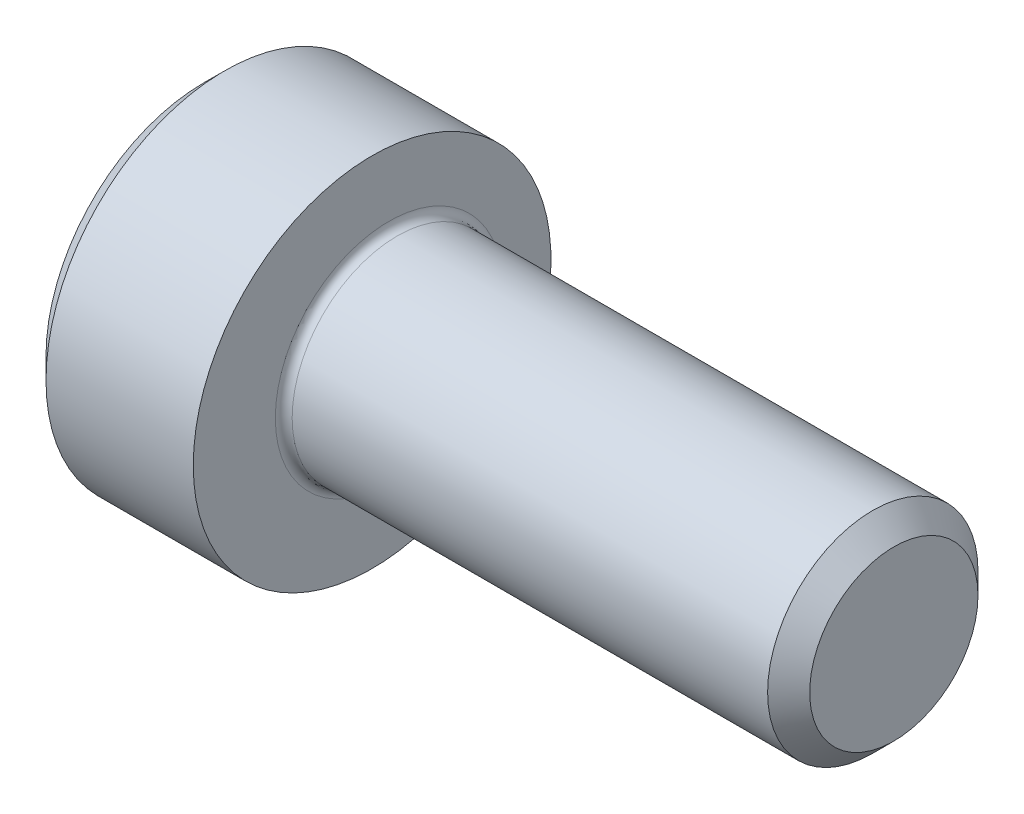
ISO-10303-21;
HEADER;
FILE_DESCRIPTION(('STEP AP214'),'2;1');
FILE_NAME('part.step','',(''),(''),'','','');
FILE_SCHEMA(('AUTOMOTIVE_DESIGN { 1 0 10303 214 1 1 1 1 }'));
ENDSEC;
DATA;
#1=APPLICATION_CONTEXT('core data for automotive mechanical design processes');
#2=APPLICATION_PROTOCOL_DEFINITION('international standard','automotive_design',2000,#1);
#3=PRODUCT_CONTEXT('',#1,'mechanical');
#4=PRODUCT('Part','Part','',(#3));
#5=PRODUCT_RELATED_PRODUCT_CATEGORY('part','',(#4));
#6=PRODUCT_DEFINITION_FORMATION('','',#4);
#7=PRODUCT_DEFINITION_CONTEXT('part definition',#1,'design');
#8=PRODUCT_DEFINITION('design','',#6,#7);
#9=PRODUCT_DEFINITION_SHAPE('','',#8);
#10=(LENGTH_UNIT() NAMED_UNIT(*) SI_UNIT(.MILLI.,.METRE.));
#11=(NAMED_UNIT(*) PLANE_ANGLE_UNIT() SI_UNIT($,.RADIAN.));
#12=(NAMED_UNIT(*) SI_UNIT($,.STERADIAN.) SOLID_ANGLE_UNIT());
#13=UNCERTAINTY_MEASURE_WITH_UNIT(LENGTH_MEASURE(1.E-05),#10,'distance_accuracy_value','');
#14=(GEOMETRIC_REPRESENTATION_CONTEXT(3) GLOBAL_UNCERTAINTY_ASSIGNED_CONTEXT((#13)) GLOBAL_UNIT_ASSIGNED_CONTEXT((#10,
#11,#12)) REPRESENTATION_CONTEXT('',''));
#15=CARTESIAN_POINT('',(0.,0.,0.));
#16=DIRECTION('',(0.,0.,1.));
#17=DIRECTION('',(1.,0.,0.));
#18=AXIS2_PLACEMENT_3D('',#15,#16,#17);
#19=CARTESIAN_POINT('',(2.5,0.,0.));
#20=DIRECTION('',(-1.,0.,0.));
#21=DIRECTION('',(0.,0.,1.));
#22=AXIS2_PLACEMENT_3D('',#19,#20,#21);
#23=PLANE('',#22);
#24=DIRECTION('',(0.,-1.,0.));
#25=VECTOR('',#24,1.);
#26=CARTESIAN_POINT('',(2.5,1.17894924968521,-2.042));
#27=LINE('',#26,#25);
#28=CARTESIAN_POINT('',(2.5,1.17894924968521,-2.042));
#29=VERTEX_POINT('',#28);
#30=CARTESIAN_POINT('',(2.5,0.,-2.042));
#31=VERTEX_POINT('',#30);
#32=EDGE_CURVE('E223',#29,#31,#27,.T.);
#33=ORIENTED_EDGE('',*,*,#32,.T.);
#34=CARTESIAN_POINT('',(2.5,0.,0.));
#35=DIRECTION('',(1.,0.,0.));
#36=DIRECTION('',(0.,0.,-1.));
#37=AXIS2_PLACEMENT_3D('',#34,#35,#36);
#38=CIRCLE('',#37,2.042);
#39=CARTESIAN_POINT('',(2.5,1.76842387452782,-1.02100000000001));
#40=VERTEX_POINT('',#39);
#41=EDGE_CURVE('E54',#31,#40,#38,.T.);
#42=ORIENTED_EDGE('',*,*,#41,.T.);
#43=DIRECTION('',(0.,-0.500000000000002,-0.866025403784437));
#44=VECTOR('',#43,1.);
#45=CARTESIAN_POINT('',(2.5,2.35789849937043,0.));
#46=LINE('',#45,#44);
#47=EDGE_CURVE('E254',#40,#29,#46,.T.);
#48=ORIENTED_EDGE('',*,*,#47,.T.);
#49=EDGE_LOOP('',(#33,#42,#48));
#50=FACE_BOUND('',#49,.T.);
#51=ADVANCED_FACE('F39',(#50),#23,.T.);
#52=CARTESIAN_POINT('',(2.5,2.35789849937043,0.));
#53=VERTEX_POINT('',#52);
#54=EDGE_CURVE('E251',#53,#40,#46,.T.);
#55=ORIENTED_EDGE('',*,*,#54,.T.);
#56=CARTESIAN_POINT('',(2.5,1.76842387452783,1.021));
#57=VERTEX_POINT('',#56);
#58=EDGE_CURVE('E210',#40,#57,#38,.T.);
#59=ORIENTED_EDGE('',*,*,#58,.T.);
#60=DIRECTION('',(0.,0.499999999999999,-0.866025403784439));
#61=VECTOR('',#60,1.);
#62=CARTESIAN_POINT('',(2.5,1.17894924968521,2.042));
#63=LINE('',#62,#61);
#64=EDGE_CURVE('E258',#57,#53,#63,.T.);
#65=ORIENTED_EDGE('',*,*,#64,.T.);
#66=EDGE_LOOP('',(#55,#59,#65));
#67=FACE_BOUND('',#66,.T.);
#68=ADVANCED_FACE('F131',(#67),#23,.T.);
#69=CARTESIAN_POINT('',(2.5,1.17894924968521,2.042));
#70=VERTEX_POINT('',#69);
#71=EDGE_CURVE('E255',#70,#57,#63,.T.);
#72=ORIENTED_EDGE('',*,*,#71,.T.);
#73=CARTESIAN_POINT('',(2.5,0.,2.042));
#74=VERTEX_POINT('',#73);
#75=EDGE_CURVE('E212',#57,#74,#38,.T.);
#76=ORIENTED_EDGE('',*,*,#75,.T.);
#77=DIRECTION('',(0.,1.,0.));
#78=VECTOR('',#77,1.);
#79=CARTESIAN_POINT('',(2.5,-1.17894924968522,2.042));
#80=LINE('',#79,#78);
#81=EDGE_CURVE('E262',#74,#70,#80,.T.);
#82=ORIENTED_EDGE('',*,*,#81,.T.);
#83=EDGE_LOOP('',(#72,#76,#82));
#84=FACE_BOUND('',#83,.T.);
#85=ADVANCED_FACE('F136',(#84),#23,.T.);
#86=CARTESIAN_POINT('',(2.5,-1.17894924968522,2.042));
#87=VERTEX_POINT('',#86);
#88=EDGE_CURVE('E259',#87,#74,#80,.T.);
#89=ORIENTED_EDGE('',*,*,#88,.T.);
#90=CARTESIAN_POINT('',(2.5,-1.76842387452783,1.021));
#91=VERTEX_POINT('',#90);
#92=EDGE_CURVE('E310',#74,#91,#38,.T.);
#93=ORIENTED_EDGE('',*,*,#92,.T.);
#94=DIRECTION('',(0.,0.5,0.866025403784438));
#95=VECTOR('',#94,1.);
#96=CARTESIAN_POINT('',(2.5,-2.35789849937043,0.));
#97=LINE('',#96,#95);
#98=EDGE_CURVE('E266',#91,#87,#97,.T.);
#99=ORIENTED_EDGE('',*,*,#98,.T.);
#100=EDGE_LOOP('',(#89,#93,#99));
#101=FACE_BOUND('',#100,.T.);
#102=ADVANCED_FACE('F309',(#101),#23,.T.);
#103=CARTESIAN_POINT('',(2.5,-2.35789849937043,0.));
#104=VERTEX_POINT('',#103);
#105=EDGE_CURVE('E263',#104,#91,#97,.T.);
#106=ORIENTED_EDGE('',*,*,#105,.T.);
#107=CARTESIAN_POINT('',(2.5,-1.76842387452783,-1.021));
#108=VERTEX_POINT('',#107);
#109=EDGE_CURVE('E311',#91,#108,#38,.T.);
#110=ORIENTED_EDGE('',*,*,#109,.T.);
#111=DIRECTION('',(0.,-0.5,0.866025403784439));
#112=VECTOR('',#111,1.);
#113=CARTESIAN_POINT('',(2.5,-1.17894924968522,-2.042));
#114=LINE('',#113,#112);
#115=EDGE_CURVE('E235',#108,#104,#114,.T.);
#116=ORIENTED_EDGE('',*,*,#115,.T.);
#117=EDGE_LOOP('',(#106,#110,#116));
#118=FACE_BOUND('',#117,.T.);
#119=ADVANCED_FACE('F128',(#118),#23,.T.);
#120=CARTESIAN_POINT('',(4.,0.,0.));
#121=DIRECTION('',(-1.,0.,0.));
#122=DIRECTION('',(0.,0.,1.));
#123=AXIS2_PLACEMENT_3D('',#120,#121,#122);
#124=CYLINDRICAL_SURFACE('',#123,4.25);
#125=CARTESIAN_POINT('',(0.500000000000008,0.,0.));
#126=DIRECTION('',(-1.,0.,0.));
#127=DIRECTION('',(0.,0.,1.));
#128=AXIS2_PLACEMENT_3D('',#125,#126,#127);
#129=CIRCLE('',#128,4.25);
#130=CARTESIAN_POINT('',(0.500000000000008,0.,4.25));
#131=VERTEX_POINT('',#130);
#132=EDGE_CURVE('E190',#131,#131,#129,.F.);
#133=ORIENTED_EDGE('',*,*,#132,.T.);
#134=EDGE_LOOP('',(#133));
#135=FACE_BOUND('',#134,.T.);
#136=CARTESIAN_POINT('',(4.,0.,0.));
#137=DIRECTION('',(-1.,0.,0.));
#138=DIRECTION('',(0.,0.,1.));
#139=AXIS2_PLACEMENT_3D('',#136,#137,#138);
#140=CIRCLE('',#139,4.25);
#141=CARTESIAN_POINT('',(4.,0.,4.25));
#142=VERTEX_POINT('',#141);
#143=EDGE_CURVE('E215',#142,#142,#140,.T.);
#144=ORIENTED_EDGE('',*,*,#143,.T.);
#145=EDGE_LOOP('',(#144));
#146=FACE_BOUND('',#145,.T.);
#147=ADVANCED_FACE('F177',(#135,#146),#124,.T.);
#148=CARTESIAN_POINT('',(4.,4.25,0.));
#149=DIRECTION('',(1.,0.,0.));
#150=DIRECTION('',(0.,0.,-1.));
#151=AXIS2_PLACEMENT_3D('',#148,#149,#150);
#152=PLANE('',#151);
#153=CARTESIAN_POINT('',(4.,0.,-0.4));
#154=DIRECTION('',(1.,0.,0.));
#155=DIRECTION('',(0.,0.,-1.));
#156=AXIS2_PLACEMENT_3D('',#153,#154,#155);
#157=CIRCLE('',#156,2.7);
#158=CARTESIAN_POINT('',(4.,0.,-3.1));
#159=VERTEX_POINT('',#158);
#160=EDGE_CURVE('E11',#159,#159,#157,.F.);
#161=ORIENTED_EDGE('',*,*,#160,.T.);
#162=EDGE_LOOP('',(#161));
#163=FACE_BOUND('',#162,.T.);
#164=ORIENTED_EDGE('',*,*,#143,.F.);
#165=EDGE_LOOP('',(#164));
#166=FACE_BOUND('',#165,.T.);
#167=ADVANCED_FACE('F173',(#163,#166),#152,.T.);
#168=CARTESIAN_POINT('',(0.,0.,0.));
#169=DIRECTION('',(-1.,0.,0.));
#170=DIRECTION('',(0.,0.,1.));
#171=AXIS2_PLACEMENT_3D('',#168,#169,#170);
#172=PLANE('',#171);
#173=CARTESIAN_POINT('',(0.,0.,2.8));
#174=DIRECTION('',(-1.,0.,0.));
#175=DIRECTION('',(0.,0.,1.));
#176=AXIS2_PLACEMENT_3D('',#173,#174,#175);
#177=CIRCLE('',#176,0.25);
#178=CARTESIAN_POINT('',(0.,0.,3.05));
#179=VERTEX_POINT('',#178);
#180=EDGE_CURVE('E271',#179,#179,#177,.T.);
#181=ORIENTED_EDGE('',*,*,#180,.F.);
#182=EDGE_LOOP('',(#181));
#183=FACE_BOUND('',#182,.T.);
#184=CARTESIAN_POINT('',(0.,0.,0.));
#185=DIRECTION('',(-1.,0.,0.));
#186=DIRECTION('',(0.,0.,1.));
#187=AXIS2_PLACEMENT_3D('',#184,#185,#186);
#188=CIRCLE('',#187,3.75);
#189=CARTESIAN_POINT('',(0.,0.,3.75));
#190=VERTEX_POINT('',#189);
#191=EDGE_CURVE('E193',#190,#190,#188,.T.);
#192=ORIENTED_EDGE('',*,*,#191,.T.);
#193=EDGE_LOOP('',(#192));
#194=FACE_BOUND('',#193,.T.);
#195=DIRECTION('',(0.,-0.5,0.866025403784439));
#196=VECTOR('',#195,1.);
#197=CARTESIAN_POINT('',(0.,-1.17894924968522,-2.042));
#198=LINE('',#197,#196);
#199=CARTESIAN_POINT('',(0.,-1.17894924968522,-2.042));
#200=VERTEX_POINT('',#199);
#201=CARTESIAN_POINT('',(0.,-2.35789849937043,0.));
#202=VERTEX_POINT('',#201);
#203=EDGE_CURVE('E62',#200,#202,#198,.T.);
#204=ORIENTED_EDGE('',*,*,#203,.F.);
#205=DIRECTION('',(0.,-1.,0.));
#206=VECTOR('',#205,1.);
#207=CARTESIAN_POINT('',(0.,1.17894924968521,-2.042));
#208=LINE('',#207,#206);
#209=CARTESIAN_POINT('',(0.,1.17894924968521,-2.042));
#210=VERTEX_POINT('',#209);
#211=EDGE_CURVE('E232',#210,#200,#208,.T.);
#212=ORIENTED_EDGE('',*,*,#211,.F.);
#213=DIRECTION('',(0.,-0.500000000000002,-0.866025403784437));
#214=VECTOR('',#213,1.);
#215=CARTESIAN_POINT('',(0.,2.35789849937043,0.));
#216=LINE('',#215,#214);
#217=CARTESIAN_POINT('',(0.,2.35789849937043,0.));
#218=VERTEX_POINT('',#217);
#219=EDGE_CURVE('E236',#218,#210,#216,.T.);
#220=ORIENTED_EDGE('',*,*,#219,.F.);
#221=DIRECTION('',(0.,0.499999999999999,-0.866025403784439));
#222=VECTOR('',#221,1.);
#223=CARTESIAN_POINT('',(0.,1.17894924968521,2.042));
#224=LINE('',#223,#222);
#225=CARTESIAN_POINT('',(0.,1.17894924968521,2.042));
#226=VERTEX_POINT('',#225);
#227=EDGE_CURVE('E239',#226,#218,#224,.T.);
#228=ORIENTED_EDGE('',*,*,#227,.F.);
#229=DIRECTION('',(0.,1.,0.));
#230=VECTOR('',#229,1.);
#231=CARTESIAN_POINT('',(0.,-1.17894924968522,2.042));
#232=LINE('',#231,#230);
#233=CARTESIAN_POINT('',(0.,-1.17894924968522,2.042));
#234=VERTEX_POINT('',#233);
#235=EDGE_CURVE('E242',#234,#226,#232,.T.);
#236=ORIENTED_EDGE('',*,*,#235,.F.);
#237=DIRECTION('',(0.,0.5,0.866025403784438));
#238=VECTOR('',#237,1.);
#239=CARTESIAN_POINT('',(0.,-2.35789849937043,0.));
#240=LINE('',#239,#238);
#241=EDGE_CURVE('E245',#202,#234,#240,.T.);
#242=ORIENTED_EDGE('',*,*,#241,.F.);
#243=EDGE_LOOP('',(#204,#212,#220,#228,#236,#242));
#244=FACE_BOUND('',#243,.T.);
#245=ADVANCED_FACE('F169',(#183,#194,#244),#172,.T.);
#246=CARTESIAN_POINT('',(16.,0.,-0.4));
#247=DIRECTION('',(-1.,0.,0.));
#248=DIRECTION('',(0.,0.,1.));
#249=AXIS2_PLACEMENT_3D('',#246,#247,#248);
#250=CYLINDRICAL_SURFACE('',#249,2.5);
#251=CARTESIAN_POINT('',(4.2,0.,-0.4));
#252=DIRECTION('',(1.,0.,0.));
#253=DIRECTION('',(0.,0.,-1.));
#254=AXIS2_PLACEMENT_3D('',#251,#252,#253);
#255=CIRCLE('',#254,2.5);
#256=CARTESIAN_POINT('',(4.2,0.,-2.9));
#257=VERTEX_POINT('',#256);
#258=EDGE_CURVE('E47',#257,#257,#255,.T.);
#259=ORIENTED_EDGE('',*,*,#258,.T.);
#260=EDGE_LOOP('',(#259));
#261=FACE_BOUND('',#260,.T.);
#262=CARTESIAN_POINT('',(15.5,0.,-0.4));
#263=DIRECTION('',(1.,0.,0.));
#264=DIRECTION('',(0.,0.,-1.));
#265=AXIS2_PLACEMENT_3D('',#262,#263,#264);
#266=CIRCLE('',#265,2.5);
#267=CARTESIAN_POINT('',(15.5,0.,-2.9));
#268=VERTEX_POINT('',#267);
#269=EDGE_CURVE('E195',#268,#268,#266,.F.);
#270=ORIENTED_EDGE('',*,*,#269,.T.);
#271=EDGE_LOOP('',(#270));
#272=FACE_BOUND('',#271,.T.);
#273=ADVANCED_FACE('F165',(#261,#272),#250,.T.);
#274=CARTESIAN_POINT('',(16.,0.,-0.4));
#275=DIRECTION('',(1.,0.,0.));
#276=DIRECTION('',(0.,0.,-1.));
#277=AXIS2_PLACEMENT_3D('',#274,#275,#276);
#278=PLANE('',#277);
#279=CARTESIAN_POINT('',(16.,0.,-0.4));
#280=DIRECTION('',(1.,0.,0.));
#281=DIRECTION('',(0.,0.,-1.));
#282=AXIS2_PLACEMENT_3D('',#279,#280,#281);
#283=CIRCLE('',#282,2.);
#284=CARTESIAN_POINT('',(16.,0.,-2.4));
#285=VERTEX_POINT('',#284);
#286=EDGE_CURVE('E199',#285,#285,#283,.T.);
#287=ORIENTED_EDGE('',*,*,#286,.T.);
#288=EDGE_LOOP('',(#287));
#289=FACE_BOUND('',#288,.T.);
#290=ADVANCED_FACE('F162',(#289),#278,.T.);
#291=CARTESIAN_POINT('',(2.5,-1.17894924968522,-2.042));
#292=DIRECTION('',(0.,-0.866025403784439,-0.5));
#293=DIRECTION('',(0.,0.5,-0.866025403784439));
#294=AXIS2_PLACEMENT_3D('',#291,#292,#293);
#295=PLANE('',#294);
#296=ORIENTED_EDGE('',*,*,#203,.T.);
#297=DIRECTION('',(-1.,0.,0.));
#298=VECTOR('',#297,1.);
#299=CARTESIAN_POINT('',(2.5,-2.35789849937043,0.));
#300=LINE('',#299,#298);
#301=EDGE_CURVE('E220',#104,#202,#300,.T.);
#302=ORIENTED_EDGE('',*,*,#301,.F.);
#303=ORIENTED_EDGE('',*,*,#115,.F.);
#304=CARTESIAN_POINT('',(2.5,-1.17894924968522,-2.042));
#305=VERTEX_POINT('',#304);
#306=EDGE_CURVE('E267',#305,#108,#114,.T.);
#307=ORIENTED_EDGE('',*,*,#306,.F.);
#308=DIRECTION('',(-1.,0.,0.));
#309=VECTOR('',#308,1.);
#310=CARTESIAN_POINT('',(2.5,-1.17894924968522,-2.042));
#311=LINE('',#310,#309);
#312=EDGE_CURVE('E219',#305,#200,#311,.T.);
#313=ORIENTED_EDGE('',*,*,#312,.T.);
#314=EDGE_LOOP('',(#296,#302,#303,#307,#313));
#315=FACE_BOUND('',#314,.T.);
#316=ADVANCED_FACE('F144',(#315),#295,.F.);
#317=CARTESIAN_POINT('',(2.5,1.17894924968521,-2.042));
#318=DIRECTION('',(0.,0.,-1.));
#319=DIRECTION('',(-1.,0.,0.));
#320=AXIS2_PLACEMENT_3D('',#317,#318,#319);
#321=PLANE('',#320);
#322=ORIENTED_EDGE('',*,*,#211,.T.);
#323=ORIENTED_EDGE('',*,*,#312,.F.);
#324=EDGE_CURVE('E250',#31,#305,#27,.T.);
#325=ORIENTED_EDGE('',*,*,#324,.F.);
#326=ORIENTED_EDGE('',*,*,#32,.F.);
#327=DIRECTION('',(-1.,0.,0.));
#328=VECTOR('',#327,1.);
#329=CARTESIAN_POINT('',(2.5,1.17894924968521,-2.042));
#330=LINE('',#329,#328);
#331=EDGE_CURVE('E229',#29,#210,#330,.T.);
#332=ORIENTED_EDGE('',*,*,#331,.T.);
#333=EDGE_LOOP('',(#322,#323,#325,#326,#332));
#334=FACE_BOUND('',#333,.T.);
#335=ADVANCED_FACE('F140',(#334),#321,.F.);
#336=CARTESIAN_POINT('',(2.5,2.35789849937043,0.));
#337=DIRECTION('',(0.,0.866025403784437,-0.500000000000002));
#338=DIRECTION('',(0.,0.500000000000002,0.866025403784437));
#339=AXIS2_PLACEMENT_3D('',#336,#337,#338);
#340=PLANE('',#339);
#341=ORIENTED_EDGE('',*,*,#219,.T.);
#342=ORIENTED_EDGE('',*,*,#331,.F.);
#343=ORIENTED_EDGE('',*,*,#47,.F.);
#344=ORIENTED_EDGE('',*,*,#54,.F.);
#345=DIRECTION('',(-1.,0.,0.));
#346=VECTOR('',#345,1.);
#347=CARTESIAN_POINT('',(2.5,2.35789849937043,0.));
#348=LINE('',#347,#346);
#349=EDGE_CURVE('E227',#53,#218,#348,.T.);
#350=ORIENTED_EDGE('',*,*,#349,.T.);
#351=EDGE_LOOP('',(#341,#342,#343,#344,#350));
#352=FACE_BOUND('',#351,.T.);
#353=ADVANCED_FACE('F143',(#352),#340,.F.);
#354=CARTESIAN_POINT('',(2.5,1.17894924968521,2.042));
#355=DIRECTION('',(0.,0.866025403784439,0.499999999999999));
#356=DIRECTION('',(0.,-0.499999999999999,0.866025403784439));
#357=AXIS2_PLACEMENT_3D('',#354,#355,#356);
#358=PLANE('',#357);
#359=ORIENTED_EDGE('',*,*,#227,.T.);
#360=ORIENTED_EDGE('',*,*,#349,.F.);
#361=ORIENTED_EDGE('',*,*,#64,.F.);
#362=ORIENTED_EDGE('',*,*,#71,.F.);
#363=DIRECTION('',(-1.,0.,0.));
#364=VECTOR('',#363,1.);
#365=CARTESIAN_POINT('',(2.5,1.17894924968521,2.042));
#366=LINE('',#365,#364);
#367=EDGE_CURVE('E225',#70,#226,#366,.T.);
#368=ORIENTED_EDGE('',*,*,#367,.T.);
#369=EDGE_LOOP('',(#359,#360,#361,#362,#368));
#370=FACE_BOUND('',#369,.T.);
#371=ADVANCED_FACE('F148',(#370),#358,.F.);
#372=CARTESIAN_POINT('',(2.5,-1.17894924968522,2.042));
#373=DIRECTION('',(0.,0.,1.));
#374=DIRECTION('',(1.,0.,0.));
#375=AXIS2_PLACEMENT_3D('',#372,#373,#374);
#376=PLANE('',#375);
#377=ORIENTED_EDGE('',*,*,#235,.T.);
#378=ORIENTED_EDGE('',*,*,#367,.F.);
#379=ORIENTED_EDGE('',*,*,#81,.F.);
#380=ORIENTED_EDGE('',*,*,#88,.F.);
#381=DIRECTION('',(-1.,0.,0.));
#382=VECTOR('',#381,1.);
#383=CARTESIAN_POINT('',(2.5,-1.17894924968522,2.042));
#384=LINE('',#383,#382);
#385=EDGE_CURVE('E222',#87,#234,#384,.T.);
#386=ORIENTED_EDGE('',*,*,#385,.T.);
#387=EDGE_LOOP('',(#377,#378,#379,#380,#386));
#388=FACE_BOUND('',#387,.T.);
#389=ADVANCED_FACE('F152',(#388),#376,.F.);
#390=CARTESIAN_POINT('',(2.5,-2.35789849937043,0.));
#391=DIRECTION('',(0.,-0.866025403784438,0.5));
#392=DIRECTION('',(0.,-0.5,-0.866025403784439));
#393=AXIS2_PLACEMENT_3D('',#390,#391,#392);
#394=PLANE('',#393);
#395=ORIENTED_EDGE('',*,*,#241,.T.);
#396=ORIENTED_EDGE('',*,*,#385,.F.);
#397=ORIENTED_EDGE('',*,*,#98,.F.);
#398=ORIENTED_EDGE('',*,*,#105,.F.);
#399=ORIENTED_EDGE('',*,*,#301,.T.);
#400=EDGE_LOOP('',(#395,#396,#397,#398,#399));
#401=FACE_BOUND('',#400,.T.);
#402=ADVANCED_FACE('F125',(#401),#394,.F.);
#403=ORIENTED_EDGE('',*,*,#306,.T.);
#404=EDGE_CURVE('E218',#108,#31,#38,.T.);
#405=ORIENTED_EDGE('',*,*,#404,.T.);
#406=ORIENTED_EDGE('',*,*,#324,.T.);
#407=EDGE_LOOP('',(#403,#405,#406));
#408=FACE_BOUND('',#407,.T.);
#409=ADVANCED_FACE('F115',(#408),#23,.T.);
#410=CARTESIAN_POINT('',(3.67894924968522,0.,0.));
#411=DIRECTION('',(-1.,0.,0.));
#412=DIRECTION('',(0.,0.,1.));
#413=AXIS2_PLACEMENT_3D('',#410,#411,#412);
#414=CONICAL_SURFACE('',#413,0.,1.0471975511966);
#415=ORIENTED_EDGE('',*,*,#41,.F.);
#416=ORIENTED_EDGE('',*,*,#404,.F.);
#417=ORIENTED_EDGE('',*,*,#109,.F.);
#418=ORIENTED_EDGE('',*,*,#92,.F.);
#419=ORIENTED_EDGE('',*,*,#75,.F.);
#420=ORIENTED_EDGE('',*,*,#58,.F.);
#421=EDGE_LOOP('',(#415,#416,#417,#418,#419,#420));
#422=FACE_BOUND('',#421,.T.);
#423=CARTESIAN_POINT('',(3.67894924968522,0.,0.));
#424=VERTEX_POINT('',#423);
#425=VERTEX_LOOP('',#424);
#426=FACE_BOUND('',#425,.T.);
#427=ADVANCED_FACE('F112',(#422,#426),#414,.F.);
#428=CARTESIAN_POINT('',(16.,0.,-0.4));
#429=DIRECTION('',(-1.,0.,0.));
#430=DIRECTION('',(0.,0.,1.));
#431=AXIS2_PLACEMENT_3D('',#428,#429,#430);
#432=CONICAL_SURFACE('',#431,2.,0.785398163397445);
#433=ORIENTED_EDGE('',*,*,#269,.F.);
#434=EDGE_LOOP('',(#433));
#435=FACE_BOUND('',#434,.T.);
#436=ORIENTED_EDGE('',*,*,#286,.F.);
#437=EDGE_LOOP('',(#436));
#438=FACE_BOUND('',#437,.T.);
#439=ADVANCED_FACE('F114',(#435,#438),#432,.T.);
#440=CARTESIAN_POINT('',(0.,0.,0.));
#441=DIRECTION('',(1.,0.,0.));
#442=DIRECTION('',(0.,0.,-1.));
#443=AXIS2_PLACEMENT_3D('',#440,#441,#442);
#444=CONICAL_SURFACE('',#443,3.75,0.785398163397444);
#445=ORIENTED_EDGE('',*,*,#132,.F.);
#446=EDGE_LOOP('',(#445));
#447=FACE_BOUND('',#446,.T.);
#448=ORIENTED_EDGE('',*,*,#191,.F.);
#449=EDGE_LOOP('',(#448));
#450=FACE_BOUND('',#449,.T.);
#451=ADVANCED_FACE('F122',(#447,#450),#444,.T.);
#452=CARTESIAN_POINT('',(4.2,0.,-0.4));
#453=DIRECTION('',(1.,0.,0.));
#454=DIRECTION('',(0.,0.,-1.));
#455=AXIS2_PLACEMENT_3D('',#452,#453,#454);
#456=TOROIDAL_SURFACE('',#455,2.7,0.2);
#457=ORIENTED_EDGE('',*,*,#160,.F.);
#458=EDGE_LOOP('',(#457));
#459=FACE_BOUND('',#458,.T.);
#460=ORIENTED_EDGE('',*,*,#258,.F.);
#461=EDGE_LOOP('',(#460));
#462=FACE_BOUND('',#461,.T.);
#463=ADVANCED_FACE('F41',(#459,#462),#456,.F.);
#464=CARTESIAN_POINT('',(0.2,0.,2.8));
#465=DIRECTION('',(-1.,0.,0.));
#466=DIRECTION('',(0.,0.,1.));
#467=AXIS2_PLACEMENT_3D('',#464,#465,#466);
#468=CYLINDRICAL_SURFACE('',#467,0.25);
#469=CARTESIAN_POINT('',(0.2,0.,2.8));
#470=DIRECTION('',(-1.,0.,0.));
#471=DIRECTION('',(0.,0.,1.));
#472=AXIS2_PLACEMENT_3D('',#469,#470,#471);
#473=CIRCLE('',#472,0.25);
#474=CARTESIAN_POINT('',(0.2,0.,3.05));
#475=VERTEX_POINT('',#474);
#476=EDGE_CURVE('E270',#475,#475,#473,.T.);
#477=ORIENTED_EDGE('',*,*,#476,.F.);
#478=EDGE_LOOP('',(#477));
#479=FACE_BOUND('',#478,.T.);
#480=ORIENTED_EDGE('',*,*,#180,.T.);
#481=EDGE_LOOP('',(#480));
#482=FACE_BOUND('',#481,.T.);
#483=ADVANCED_FACE('F185',(#479,#482),#468,.F.);
#484=CARTESIAN_POINT('',(0.2,0.,2.8));
#485=DIRECTION('',(-1.,0.,0.));
#486=DIRECTION('',(0.,0.,1.));
#487=AXIS2_PLACEMENT_3D('',#484,#485,#486);
#488=PLANE('',#487);
#489=ORIENTED_EDGE('',*,*,#476,.T.);
#490=EDGE_LOOP('',(#489));
#491=FACE_BOUND('',#490,.T.);
#492=ADVANCED_FACE('F277',(#491),#488,.T.);
#493=CLOSED_SHELL('',(#51,#68,#85,#102,#119,#147,#167,#245,#273,#290,#316,#335,#353,#371,#389,
#402,#409,#427,#439,#451,#463,#483,#492));
#494=MANIFOLD_SOLID_BREP('B2',#493);
#495=ADVANCED_BREP_SHAPE_REPRESENTATION('',(#18,#494),#14);
#496=SHAPE_DEFINITION_REPRESENTATION(#9,#495);
ENDSEC;
END-ISO-10303-21;
